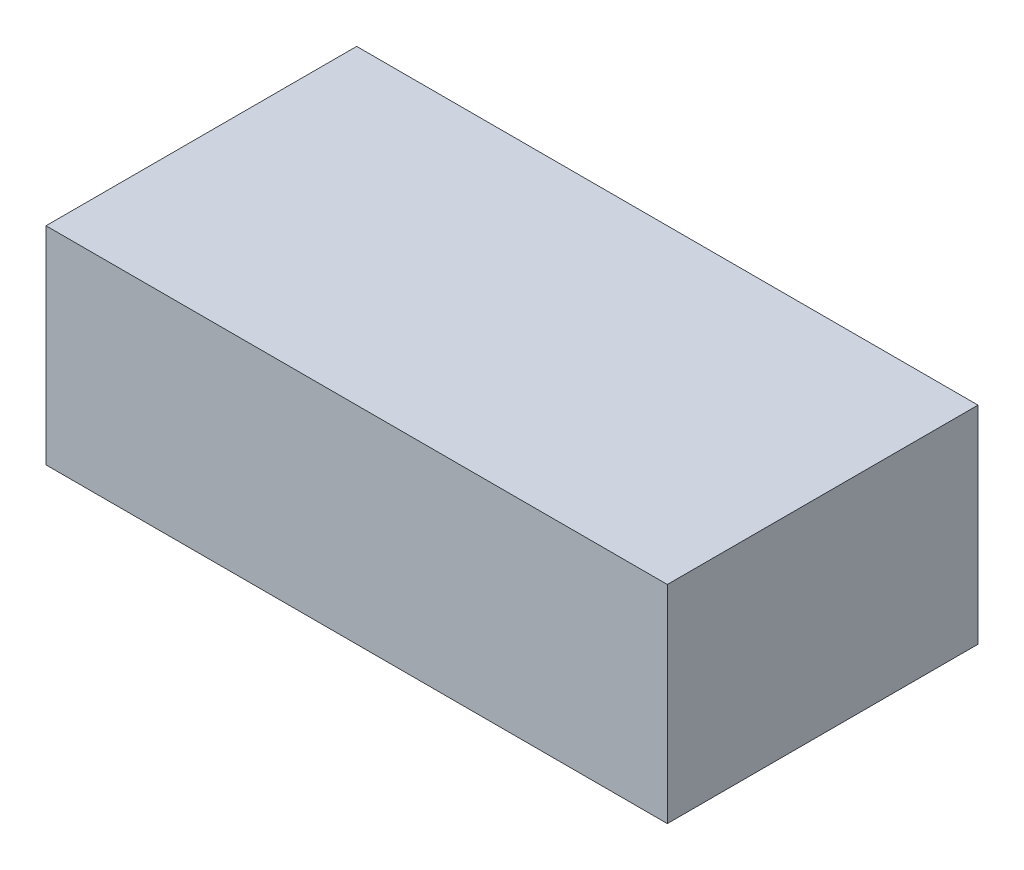
ISO-10303-21;
HEADER;
FILE_DESCRIPTION(('STEP AP214'),'2;1');
FILE_NAME('part.step','',(''),(''),'','','');
FILE_SCHEMA(('AUTOMOTIVE_DESIGN { 1 0 10303 214 1 1 1 1 }'));
ENDSEC;
DATA;
#1=APPLICATION_CONTEXT('core data for automotive mechanical design processes');
#2=APPLICATION_PROTOCOL_DEFINITION('international standard','automotive_design',2000,#1);
#3=PRODUCT_CONTEXT('',#1,'mechanical');
#4=PRODUCT('Part','Part','',(#3));
#5=PRODUCT_RELATED_PRODUCT_CATEGORY('part','',(#4));
#6=PRODUCT_DEFINITION_FORMATION('','',#4);
#7=PRODUCT_DEFINITION_CONTEXT('part definition',#1,'design');
#8=PRODUCT_DEFINITION('design','',#6,#7);
#9=PRODUCT_DEFINITION_SHAPE('','',#8);
#10=(LENGTH_UNIT() NAMED_UNIT(*) SI_UNIT(.MILLI.,.METRE.));
#11=(NAMED_UNIT(*) PLANE_ANGLE_UNIT() SI_UNIT($,.RADIAN.));
#12=(NAMED_UNIT(*) SI_UNIT($,.STERADIAN.) SOLID_ANGLE_UNIT());
#13=UNCERTAINTY_MEASURE_WITH_UNIT(LENGTH_MEASURE(1.E-05),#10,'distance_accuracy_value','');
#14=(GEOMETRIC_REPRESENTATION_CONTEXT(3) GLOBAL_UNCERTAINTY_ASSIGNED_CONTEXT((#13)) GLOBAL_UNIT_ASSIGNED_CONTEXT((#10,
#11,#12)) REPRESENTATION_CONTEXT('',''));
#15=CARTESIAN_POINT('',(0.,0.,0.));
#16=DIRECTION('',(0.,0.,1.));
#17=DIRECTION('',(1.,0.,0.));
#18=AXIS2_PLACEMENT_3D('',#15,#16,#17);
#19=CARTESIAN_POINT('',(-15.7921739130435,12.7,6.29478260869564));
#20=DIRECTION('',(-1.,0.,0.));
#21=DIRECTION('',(0.,0.,1.));
#22=AXIS2_PLACEMENT_3D('',#19,#20,#21);
#23=PLANE('',#22);
#24=DIRECTION('',(0.,0.,-1.));
#25=VECTOR('',#24,1.);
#26=CARTESIAN_POINT('',(-15.7921739130435,0.,6.29478260869564));
#27=LINE('',#26,#25);
#28=CARTESIAN_POINT('',(-15.7921739130435,0.,6.29478260869564));
#29=VERTEX_POINT('',#28);
#30=CARTESIAN_POINT('',(-15.7921739130435,0.,-12.7552173913044));
#31=VERTEX_POINT('',#30);
#32=EDGE_CURVE('E102',#29,#31,#27,.T.);
#33=ORIENTED_EDGE('',*,*,#32,.F.);
#34=DIRECTION('',(0.,-1.,0.));
#35=VECTOR('',#34,1.);
#36=CARTESIAN_POINT('',(-15.7921739130435,12.7,6.29478260869564));
#37=LINE('',#36,#35);
#38=CARTESIAN_POINT('',(-15.7921739130435,12.7,6.29478260869564));
#39=VERTEX_POINT('',#38);
#40=EDGE_CURVE('E11',#39,#29,#37,.T.);
#41=ORIENTED_EDGE('',*,*,#40,.F.);
#42=DIRECTION('',(0.,0.,-1.));
#43=VECTOR('',#42,1.);
#44=CARTESIAN_POINT('',(-15.7921739130435,12.7,6.29478260869564));
#45=LINE('',#44,#43);
#46=CARTESIAN_POINT('',(-15.7921739130435,12.7,-12.7552173913044));
#47=VERTEX_POINT('',#46);
#48=EDGE_CURVE('E97',#39,#47,#45,.T.);
#49=ORIENTED_EDGE('',*,*,#48,.T.);
#50=DIRECTION('',(0.,-1.,0.));
#51=VECTOR('',#50,1.);
#52=CARTESIAN_POINT('',(-15.7921739130435,12.7,-12.7552173913044));
#53=LINE('',#52,#51);
#54=EDGE_CURVE('E40',#47,#31,#53,.T.);
#55=ORIENTED_EDGE('',*,*,#54,.T.);
#56=EDGE_LOOP('',(#33,#41,#49,#55));
#57=FACE_BOUND('',#56,.T.);
#58=ADVANCED_FACE('F37',(#57),#23,.T.);
#59=CARTESIAN_POINT('',(-15.7921739130435,12.7,6.29478260869564));
#60=DIRECTION('',(0.,0.,-1.));
#61=DIRECTION('',(-1.,0.,0.));
#62=AXIS2_PLACEMENT_3D('',#59,#60,#61);
#63=PLANE('',#62);
#64=DIRECTION('',(1.,0.,0.));
#65=VECTOR('',#64,1.);
#66=CARTESIAN_POINT('',(-15.7921739130435,0.,6.29478260869564));
#67=LINE('',#66,#65);
#68=CARTESIAN_POINT('',(22.3078260869565,0.,6.29478260869564));
#69=VERTEX_POINT('',#68);
#70=EDGE_CURVE('E70',#29,#69,#67,.T.);
#71=ORIENTED_EDGE('',*,*,#70,.T.);
#72=DIRECTION('',(0.,-1.,0.));
#73=VECTOR('',#72,1.);
#74=CARTESIAN_POINT('',(22.3078260869565,12.7,6.29478260869564));
#75=LINE('',#74,#73);
#76=CARTESIAN_POINT('',(22.3078260869565,12.7,6.29478260869564));
#77=VERTEX_POINT('',#76);
#78=EDGE_CURVE('E46',#77,#69,#75,.T.);
#79=ORIENTED_EDGE('',*,*,#78,.F.);
#80=DIRECTION('',(1.,0.,0.));
#81=VECTOR('',#80,1.);
#82=CARTESIAN_POINT('',(-15.7921739130435,12.7,6.29478260869564));
#83=LINE('',#82,#81);
#84=EDGE_CURVE('E87',#39,#77,#83,.T.);
#85=ORIENTED_EDGE('',*,*,#84,.F.);
#86=ORIENTED_EDGE('',*,*,#40,.T.);
#87=EDGE_LOOP('',(#71,#79,#85,#86));
#88=FACE_BOUND('',#87,.T.);
#89=ADVANCED_FACE('F112',(#88),#63,.F.);
#90=CARTESIAN_POINT('',(22.3078260869565,12.7,6.29478260869564));
#91=DIRECTION('',(-1.,0.,0.));
#92=DIRECTION('',(0.,0.,1.));
#93=AXIS2_PLACEMENT_3D('',#90,#91,#92);
#94=PLANE('',#93);
#95=DIRECTION('',(0.,0.,-1.));
#96=VECTOR('',#95,1.);
#97=CARTESIAN_POINT('',(22.3078260869565,0.,6.29478260869564));
#98=LINE('',#97,#96);
#99=CARTESIAN_POINT('',(22.3078260869565,0.,-12.7552173913044));
#100=VERTEX_POINT('',#99);
#101=EDGE_CURVE('E94',#69,#100,#98,.T.);
#102=ORIENTED_EDGE('',*,*,#101,.T.);
#103=DIRECTION('',(0.,-1.,0.));
#104=VECTOR('',#103,1.);
#105=CARTESIAN_POINT('',(22.3078260869565,12.7,-12.7552173913044));
#106=LINE('',#105,#104);
#107=CARTESIAN_POINT('',(22.3078260869565,12.7,-12.7552173913044));
#108=VERTEX_POINT('',#107);
#109=EDGE_CURVE('E91',#108,#100,#106,.T.);
#110=ORIENTED_EDGE('',*,*,#109,.F.);
#111=DIRECTION('',(0.,0.,-1.));
#112=VECTOR('',#111,1.);
#113=CARTESIAN_POINT('',(22.3078260869565,12.7,6.29478260869564));
#114=LINE('',#113,#112);
#115=EDGE_CURVE('E82',#77,#108,#114,.T.);
#116=ORIENTED_EDGE('',*,*,#115,.F.);
#117=ORIENTED_EDGE('',*,*,#78,.T.);
#118=EDGE_LOOP('',(#102,#110,#116,#117));
#119=FACE_BOUND('',#118,.T.);
#120=ADVANCED_FACE('F92',(#119),#94,.F.);
#121=CARTESIAN_POINT('',(-15.7921739130435,12.7,-12.7552173913044));
#122=DIRECTION('',(0.,0.,-1.));
#123=DIRECTION('',(-1.,0.,0.));
#124=AXIS2_PLACEMENT_3D('',#121,#122,#123);
#125=PLANE('',#124);
#126=DIRECTION('',(1.,0.,0.));
#127=VECTOR('',#126,1.);
#128=CARTESIAN_POINT('',(-15.7921739130435,0.,-12.7552173913044));
#129=LINE('',#128,#127);
#130=EDGE_CURVE('E105',#31,#100,#129,.T.);
#131=ORIENTED_EDGE('',*,*,#130,.F.);
#132=ORIENTED_EDGE('',*,*,#54,.F.);
#133=DIRECTION('',(1.,0.,0.));
#134=VECTOR('',#133,1.);
#135=CARTESIAN_POINT('',(-15.7921739130435,12.7,-12.7552173913044));
#136=LINE('',#135,#134);
#137=EDGE_CURVE('E86',#47,#108,#136,.T.);
#138=ORIENTED_EDGE('',*,*,#137,.T.);
#139=ORIENTED_EDGE('',*,*,#109,.T.);
#140=EDGE_LOOP('',(#131,#132,#138,#139));
#141=FACE_BOUND('',#140,.T.);
#142=ADVANCED_FACE('F96',(#141),#125,.T.);
#143=CARTESIAN_POINT('',(0.,12.7,0.));
#144=DIRECTION('',(0.,-1.,0.));
#145=DIRECTION('',(0.,0.,-1.));
#146=AXIS2_PLACEMENT_3D('',#143,#144,#145);
#147=PLANE('',#146);
#148=ORIENTED_EDGE('',*,*,#48,.F.);
#149=ORIENTED_EDGE('',*,*,#84,.T.);
#150=ORIENTED_EDGE('',*,*,#115,.T.);
#151=ORIENTED_EDGE('',*,*,#137,.F.);
#152=EDGE_LOOP('',(#148,#149,#150,#151));
#153=FACE_BOUND('',#152,.T.);
#154=ADVANCED_FACE('F85',(#153),#147,.F.);
#155=CARTESIAN_POINT('',(0.,0.,0.));
#156=DIRECTION('',(0.,-1.,0.));
#157=DIRECTION('',(0.,0.,-1.));
#158=AXIS2_PLACEMENT_3D('',#155,#156,#157);
#159=PLANE('',#158);
#160=ORIENTED_EDGE('',*,*,#32,.T.);
#161=ORIENTED_EDGE('',*,*,#130,.T.);
#162=ORIENTED_EDGE('',*,*,#101,.F.);
#163=ORIENTED_EDGE('',*,*,#70,.F.);
#164=EDGE_LOOP('',(#160,#161,#162,#163));
#165=FACE_BOUND('',#164,.T.);
#166=ADVANCED_FACE('F110',(#165),#159,.T.);
#167=CLOSED_SHELL('',(#58,#89,#120,#142,#154,#166));
#168=MANIFOLD_SOLID_BREP('B2',#167);
#169=ADVANCED_BREP_SHAPE_REPRESENTATION('',(#18,#168),#14);
#170=SHAPE_DEFINITION_REPRESENTATION(#9,#169);
ENDSEC;
END-ISO-10303-21;
